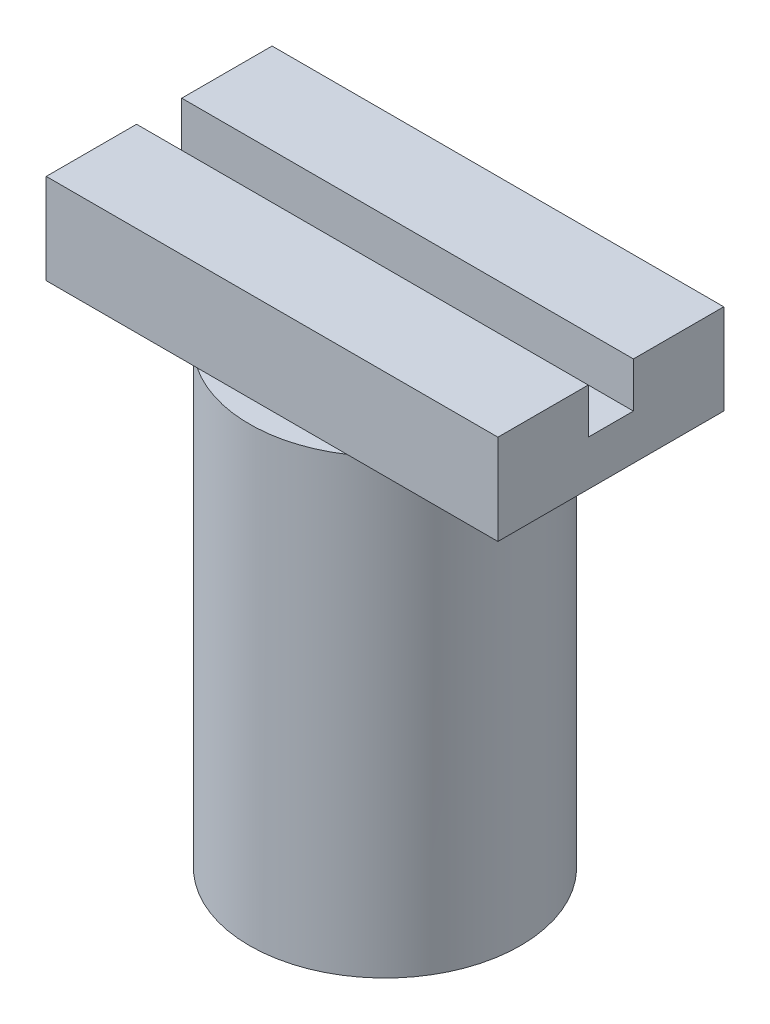
ISO-10303-21;
HEADER;
FILE_DESCRIPTION(('STEP AP214'),'2;1');
FILE_NAME('part.step','',(''),(''),'','','');
FILE_SCHEMA(('AUTOMOTIVE_DESIGN { 1 0 10303 214 1 1 1 1 }'));
ENDSEC;
DATA;
#1=APPLICATION_CONTEXT('core data for automotive mechanical design processes');
#2=APPLICATION_PROTOCOL_DEFINITION('international standard','automotive_design',2000,#1);
#3=PRODUCT_CONTEXT('',#1,'mechanical');
#4=PRODUCT('Part','Part','',(#3));
#5=PRODUCT_RELATED_PRODUCT_CATEGORY('part','',(#4));
#6=PRODUCT_DEFINITION_FORMATION('','',#4);
#7=PRODUCT_DEFINITION_CONTEXT('part definition',#1,'design');
#8=PRODUCT_DEFINITION('design','',#6,#7);
#9=PRODUCT_DEFINITION_SHAPE('','',#8);
#10=(LENGTH_UNIT() NAMED_UNIT(*) SI_UNIT(.MILLI.,.METRE.));
#11=(NAMED_UNIT(*) PLANE_ANGLE_UNIT() SI_UNIT($,.RADIAN.));
#12=(NAMED_UNIT(*) SI_UNIT($,.STERADIAN.) SOLID_ANGLE_UNIT());
#13=UNCERTAINTY_MEASURE_WITH_UNIT(LENGTH_MEASURE(1.E-05),#10,'distance_accuracy_value','');
#14=(GEOMETRIC_REPRESENTATION_CONTEXT(3) GLOBAL_UNCERTAINTY_ASSIGNED_CONTEXT((#13)) GLOBAL_UNIT_ASSIGNED_CONTEXT((#10,
#11,#12)) REPRESENTATION_CONTEXT('',''));
#15=CARTESIAN_POINT('',(0.,0.,0.));
#16=DIRECTION('',(0.,0.,1.));
#17=DIRECTION('',(1.,0.,0.));
#18=AXIS2_PLACEMENT_3D('',#15,#16,#17);
#19=CARTESIAN_POINT('',(0.,12.,0.));
#20=DIRECTION('',(0.,-1.,0.));
#21=DIRECTION('',(0.,0.,-1.));
#22=AXIS2_PLACEMENT_3D('',#19,#20,#21);
#23=PLANE('',#22);
#24=DIRECTION('',(0.,0.,1.));
#25=VECTOR('',#24,1.);
#26=CARTESIAN_POINT('',(-5.,12.,2.5));
#27=LINE('',#26,#25);
#28=CARTESIAN_POINT('',(-5.,12.,-2.5));
#29=VERTEX_POINT('',#28);
#30=CARTESIAN_POINT('',(-5.,12.,-0.5));
#31=VERTEX_POINT('',#30);
#32=EDGE_CURVE('E165',#29,#31,#27,.T.);
#33=ORIENTED_EDGE('',*,*,#32,.T.);
#34=DIRECTION('',(-1.,0.,0.));
#35=VECTOR('',#34,1.);
#36=CARTESIAN_POINT('',(5.,12.,-0.5));
#37=LINE('',#36,#35);
#38=CARTESIAN_POINT('',(5.,12.,-0.5));
#39=VERTEX_POINT('',#38);
#40=EDGE_CURVE('E142',#39,#31,#37,.T.);
#41=ORIENTED_EDGE('',*,*,#40,.F.);
#42=DIRECTION('',(0.,0.,-1.));
#43=VECTOR('',#42,1.);
#44=CARTESIAN_POINT('',(5.,12.,2.5));
#45=LINE('',#44,#43);
#46=CARTESIAN_POINT('',(5.,12.,-2.5));
#47=VERTEX_POINT('',#46);
#48=EDGE_CURVE('E162',#39,#47,#45,.T.);
#49=ORIENTED_EDGE('',*,*,#48,.T.);
#50=DIRECTION('',(-1.,0.,0.));
#51=VECTOR('',#50,1.);
#52=CARTESIAN_POINT('',(-5.,12.,-2.5));
#53=LINE('',#52,#51);
#54=EDGE_CURVE('E161',#47,#29,#53,.T.);
#55=ORIENTED_EDGE('',*,*,#54,.T.);
#56=EDGE_LOOP('',(#33,#41,#49,#55));
#57=FACE_BOUND('',#56,.T.);
#58=ADVANCED_FACE('F45',(#57),#23,.F.);
#59=CARTESIAN_POINT('',(0.,10.,0.));
#60=DIRECTION('',(0.,1.,0.));
#61=DIRECTION('',(0.,0.,1.));
#62=AXIS2_PLACEMENT_3D('',#59,#60,#61);
#63=PLANE('',#62);
#64=DIRECTION('',(1.,0.,0.));
#65=VECTOR('',#64,1.);
#66=CARTESIAN_POINT('',(-5.,10.,2.5));
#67=LINE('',#66,#65);
#68=CARTESIAN_POINT('',(-1.6583123951777,10.,2.5));
#69=VERTEX_POINT('',#68);
#70=CARTESIAN_POINT('',(1.6583123951777,10.,2.5));
#71=VERTEX_POINT('',#70);
#72=EDGE_CURVE('E11',#69,#71,#67,.T.);
#73=ORIENTED_EDGE('',*,*,#72,.F.);
#74=CARTESIAN_POINT('',(0.,10.,0.));
#75=DIRECTION('',(0.,1.,0.));
#76=DIRECTION('',(0.,0.,1.));
#77=AXIS2_PLACEMENT_3D('',#74,#75,#76);
#78=CIRCLE('',#77,3.);
#79=EDGE_CURVE('E206',#69,#71,#78,.T.);
#80=ORIENTED_EDGE('',*,*,#79,.T.);
#81=EDGE_LOOP('',(#73,#80));
#82=FACE_BOUND('',#81,.T.);
#83=ADVANCED_FACE('F235',(#82),#63,.T.);
#84=CARTESIAN_POINT('',(0.,10.,0.));
#85=DIRECTION('',(0.,-1.,0.));
#86=DIRECTION('',(0.,0.,-1.));
#87=AXIS2_PLACEMENT_3D('',#84,#85,#86);
#88=CYLINDRICAL_SURFACE('',#87,3.);
#89=CARTESIAN_POINT('',(1.6583123951777,10.,-2.5));
#90=VERTEX_POINT('',#89);
#91=EDGE_CURVE('E202',#71,#90,#78,.T.);
#92=ORIENTED_EDGE('',*,*,#91,.F.);
#93=ORIENTED_EDGE('',*,*,#79,.F.);
#94=CARTESIAN_POINT('',(-1.6583123951777,10.,-2.5));
#95=VERTEX_POINT('',#94);
#96=EDGE_CURVE('E213',#95,#69,#78,.T.);
#97=ORIENTED_EDGE('',*,*,#96,.F.);
#98=EDGE_CURVE('E205',#90,#95,#78,.T.);
#99=ORIENTED_EDGE('',*,*,#98,.F.);
#100=EDGE_LOOP('',(#92,#93,#97,#99));
#101=FACE_BOUND('',#100,.T.);
#102=CARTESIAN_POINT('',(0.,0.,0.));
#103=DIRECTION('',(0.,1.,0.));
#104=DIRECTION('',(0.,0.,1.));
#105=AXIS2_PLACEMENT_3D('',#102,#103,#104);
#106=CIRCLE('',#105,3.);
#107=CARTESIAN_POINT('',(0.,0.,3.));
#108=VERTEX_POINT('',#107);
#109=EDGE_CURVE('E49',#108,#108,#106,.T.);
#110=ORIENTED_EDGE('',*,*,#109,.T.);
#111=EDGE_LOOP('',(#110));
#112=FACE_BOUND('',#111,.T.);
#113=ADVANCED_FACE('F47',(#101,#112),#88,.T.);
#114=DIRECTION('',(-1.,0.,0.));
#115=VECTOR('',#114,1.);
#116=CARTESIAN_POINT('',(-5.,10.,-2.5));
#117=LINE('',#116,#115);
#118=EDGE_CURVE('E55',#90,#95,#117,.T.);
#119=ORIENTED_EDGE('',*,*,#118,.F.);
#120=ORIENTED_EDGE('',*,*,#98,.T.);
#121=EDGE_LOOP('',(#119,#120));
#122=FACE_BOUND('',#121,.T.);
#123=ADVANCED_FACE('F225',(#122),#63,.T.);
#124=CARTESIAN_POINT('',(0.,0.,0.));
#125=DIRECTION('',(0.,1.,0.));
#126=DIRECTION('',(0.,0.,1.));
#127=AXIS2_PLACEMENT_3D('',#124,#125,#126);
#128=PLANE('',#127);
#129=ORIENTED_EDGE('',*,*,#109,.F.);
#130=EDGE_LOOP('',(#129));
#131=FACE_BOUND('',#130,.T.);
#132=ADVANCED_FACE('F222',(#131),#128,.F.);
#133=CARTESIAN_POINT('',(0.,10.,0.));
#134=DIRECTION('',(0.,-1.,0.));
#135=DIRECTION('',(0.,0.,-1.));
#136=AXIS2_PLACEMENT_3D('',#133,#134,#135);
#137=PLANE('',#136);
#138=CARTESIAN_POINT('',(5.,10.,2.5));
#139=VERTEX_POINT('',#138);
#140=EDGE_CURVE('E58',#71,#139,#67,.T.);
#141=ORIENTED_EDGE('',*,*,#140,.F.);
#142=ORIENTED_EDGE('',*,*,#91,.T.);
#143=CARTESIAN_POINT('',(5.,10.,-2.5));
#144=VERTEX_POINT('',#143);
#145=EDGE_CURVE('E179',#144,#90,#117,.T.);
#146=ORIENTED_EDGE('',*,*,#145,.F.);
#147=DIRECTION('',(0.,0.,-1.));
#148=VECTOR('',#147,1.);
#149=CARTESIAN_POINT('',(5.,10.,2.5));
#150=LINE('',#149,#148);
#151=EDGE_CURVE('E173',#139,#144,#150,.T.);
#152=ORIENTED_EDGE('',*,*,#151,.F.);
#153=EDGE_LOOP('',(#141,#142,#146,#152));
#154=FACE_BOUND('',#153,.T.);
#155=ADVANCED_FACE('F224',(#154),#137,.T.);
#156=CARTESIAN_POINT('',(5.,12.,2.5));
#157=DIRECTION('',(-1.,0.,0.));
#158=DIRECTION('',(0.,0.,1.));
#159=AXIS2_PLACEMENT_3D('',#156,#157,#158);
#160=PLANE('',#159);
#161=ORIENTED_EDGE('',*,*,#48,.F.);
#162=DIRECTION('',(0.,1.,0.));
#163=VECTOR('',#162,1.);
#164=CARTESIAN_POINT('',(5.,11.,-0.5));
#165=LINE('',#164,#163);
#166=CARTESIAN_POINT('',(5.,11.,-0.5));
#167=VERTEX_POINT('',#166);
#168=EDGE_CURVE('E152',#167,#39,#165,.T.);
#169=ORIENTED_EDGE('',*,*,#168,.F.);
#170=DIRECTION('',(0.,0.,-1.));
#171=VECTOR('',#170,1.);
#172=CARTESIAN_POINT('',(5.,11.,-0.5));
#173=LINE('',#172,#171);
#174=CARTESIAN_POINT('',(5.,11.,0.5));
#175=VERTEX_POINT('',#174);
#176=EDGE_CURVE('E131',#175,#167,#173,.T.);
#177=ORIENTED_EDGE('',*,*,#176,.F.);
#178=DIRECTION('',(0.,1.,0.));
#179=VECTOR('',#178,1.);
#180=CARTESIAN_POINT('',(5.,11.,0.5));
#181=LINE('',#180,#179);
#182=CARTESIAN_POINT('',(5.,12.,0.5));
#183=VERTEX_POINT('',#182);
#184=EDGE_CURVE('E127',#175,#183,#181,.T.);
#185=ORIENTED_EDGE('',*,*,#184,.T.);
#186=CARTESIAN_POINT('',(5.,12.,2.5));
#187=VERTEX_POINT('',#186);
#188=EDGE_CURVE('E157',#187,#183,#45,.T.);
#189=ORIENTED_EDGE('',*,*,#188,.F.);
#190=DIRECTION('',(0.,-1.,0.));
#191=VECTOR('',#190,1.);
#192=CARTESIAN_POINT('',(5.,12.,2.5));
#193=LINE('',#192,#191);
#194=EDGE_CURVE('E172',#187,#139,#193,.T.);
#195=ORIENTED_EDGE('',*,*,#194,.T.);
#196=ORIENTED_EDGE('',*,*,#151,.T.);
#197=DIRECTION('',(0.,-1.,0.));
#198=VECTOR('',#197,1.);
#199=CARTESIAN_POINT('',(5.,12.,-2.5));
#200=LINE('',#199,#198);
#201=EDGE_CURVE('E199',#47,#144,#200,.T.);
#202=ORIENTED_EDGE('',*,*,#201,.F.);
#203=EDGE_LOOP('',(#161,#169,#177,#185,#189,#195,#196,#202));
#204=FACE_BOUND('',#203,.T.);
#205=ADVANCED_FACE('F230',(#204),#160,.F.);
#206=CARTESIAN_POINT('',(-5.,12.,-2.5));
#207=DIRECTION('',(0.,0.,1.));
#208=DIRECTION('',(1.,0.,0.));
#209=AXIS2_PLACEMENT_3D('',#206,#207,#208);
#210=PLANE('',#209);
#211=ORIENTED_EDGE('',*,*,#145,.T.);
#212=ORIENTED_EDGE('',*,*,#118,.T.);
#213=CARTESIAN_POINT('',(-5.,10.,-2.5));
#214=VERTEX_POINT('',#213);
#215=EDGE_CURVE('E177',#95,#214,#117,.T.);
#216=ORIENTED_EDGE('',*,*,#215,.T.);
#217=DIRECTION('',(0.,-1.,0.));
#218=VECTOR('',#217,1.);
#219=CARTESIAN_POINT('',(-5.,12.,-2.5));
#220=LINE('',#219,#218);
#221=EDGE_CURVE('E195',#29,#214,#220,.T.);
#222=ORIENTED_EDGE('',*,*,#221,.F.);
#223=ORIENTED_EDGE('',*,*,#54,.F.);
#224=ORIENTED_EDGE('',*,*,#201,.T.);
#225=EDGE_LOOP('',(#211,#212,#216,#222,#223,#224));
#226=FACE_BOUND('',#225,.T.);
#227=ADVANCED_FACE('F283',(#226),#210,.F.);
#228=CARTESIAN_POINT('',(-5.,12.,2.5));
#229=DIRECTION('',(1.,0.,0.));
#230=DIRECTION('',(0.,0.,-1.));
#231=AXIS2_PLACEMENT_3D('',#228,#229,#230);
#232=PLANE('',#231);
#233=DIRECTION('',(0.,0.,1.));
#234=VECTOR('',#233,1.);
#235=CARTESIAN_POINT('',(-5.,11.,-0.5));
#236=LINE('',#235,#234);
#237=CARTESIAN_POINT('',(-5.,11.,-0.5));
#238=VERTEX_POINT('',#237);
#239=CARTESIAN_POINT('',(-5.,11.,0.5));
#240=VERTEX_POINT('',#239);
#241=EDGE_CURVE('E132',#238,#240,#236,.T.);
#242=ORIENTED_EDGE('',*,*,#241,.F.);
#243=DIRECTION('',(0.,1.,0.));
#244=VECTOR('',#243,1.);
#245=CARTESIAN_POINT('',(-5.,11.,-0.5));
#246=LINE('',#245,#244);
#247=EDGE_CURVE('E178',#238,#31,#246,.T.);
#248=ORIENTED_EDGE('',*,*,#247,.T.);
#249=ORIENTED_EDGE('',*,*,#32,.F.);
#250=ORIENTED_EDGE('',*,*,#221,.T.);
#251=DIRECTION('',(0.,0.,1.));
#252=VECTOR('',#251,1.);
#253=CARTESIAN_POINT('',(-5.,10.,2.5));
#254=LINE('',#253,#252);
#255=CARTESIAN_POINT('',(-5.,10.,2.5));
#256=VERTEX_POINT('',#255);
#257=EDGE_CURVE('E183',#214,#256,#254,.T.);
#258=ORIENTED_EDGE('',*,*,#257,.T.);
#259=DIRECTION('',(0.,-1.,0.));
#260=VECTOR('',#259,1.);
#261=CARTESIAN_POINT('',(-5.,12.,2.5));
#262=LINE('',#261,#260);
#263=CARTESIAN_POINT('',(-5.,12.,2.5));
#264=VERTEX_POINT('',#263);
#265=EDGE_CURVE('E191',#264,#256,#262,.T.);
#266=ORIENTED_EDGE('',*,*,#265,.F.);
#267=CARTESIAN_POINT('',(-5.,12.,0.5));
#268=VERTEX_POINT('',#267);
#269=EDGE_CURVE('E147',#268,#264,#27,.T.);
#270=ORIENTED_EDGE('',*,*,#269,.F.);
#271=DIRECTION('',(0.,1.,0.));
#272=VECTOR('',#271,1.);
#273=CARTESIAN_POINT('',(-5.,11.,0.5));
#274=LINE('',#273,#272);
#275=EDGE_CURVE('E65',#240,#268,#274,.T.);
#276=ORIENTED_EDGE('',*,*,#275,.F.);
#277=EDGE_LOOP('',(#242,#248,#249,#250,#258,#266,#270,#276));
#278=FACE_BOUND('',#277,.T.);
#279=ADVANCED_FACE('F145',(#278),#232,.F.);
#280=CARTESIAN_POINT('',(-5.,12.,2.5));
#281=DIRECTION('',(0.,0.,-1.));
#282=DIRECTION('',(-1.,0.,0.));
#283=AXIS2_PLACEMENT_3D('',#280,#281,#282);
#284=PLANE('',#283);
#285=EDGE_CURVE('E57',#256,#69,#67,.T.);
#286=ORIENTED_EDGE('',*,*,#285,.T.);
#287=ORIENTED_EDGE('',*,*,#72,.T.);
#288=ORIENTED_EDGE('',*,*,#140,.T.);
#289=ORIENTED_EDGE('',*,*,#194,.F.);
#290=DIRECTION('',(1.,0.,0.));
#291=VECTOR('',#290,1.);
#292=CARTESIAN_POINT('',(-5.,12.,2.5));
#293=LINE('',#292,#291);
#294=EDGE_CURVE('E169',#264,#187,#293,.T.);
#295=ORIENTED_EDGE('',*,*,#294,.F.);
#296=ORIENTED_EDGE('',*,*,#265,.T.);
#297=EDGE_LOOP('',(#286,#287,#288,#289,#295,#296));
#298=FACE_BOUND('',#297,.T.);
#299=ADVANCED_FACE('F245',(#298),#284,.F.);
#300=ORIENTED_EDGE('',*,*,#188,.T.);
#301=DIRECTION('',(1.,0.,0.));
#302=VECTOR('',#301,1.);
#303=CARTESIAN_POINT('',(5.,12.,0.5));
#304=LINE('',#303,#302);
#305=EDGE_CURVE('E256',#268,#183,#304,.T.);
#306=ORIENTED_EDGE('',*,*,#305,.F.);
#307=ORIENTED_EDGE('',*,*,#269,.T.);
#308=ORIENTED_EDGE('',*,*,#294,.T.);
#309=EDGE_LOOP('',(#300,#306,#307,#308));
#310=FACE_BOUND('',#309,.T.);
#311=ADVANCED_FACE('F239',(#310),#23,.F.);
#312=ORIENTED_EDGE('',*,*,#215,.F.);
#313=ORIENTED_EDGE('',*,*,#96,.T.);
#314=ORIENTED_EDGE('',*,*,#285,.F.);
#315=ORIENTED_EDGE('',*,*,#257,.F.);
#316=EDGE_LOOP('',(#312,#313,#314,#315));
#317=FACE_BOUND('',#316,.T.);
#318=ADVANCED_FACE('F232',(#317),#137,.T.);
#319=CARTESIAN_POINT('',(5.,11.,-0.5));
#320=DIRECTION('',(0.,0.,-1.));
#321=DIRECTION('',(-1.,0.,0.));
#322=AXIS2_PLACEMENT_3D('',#319,#320,#321);
#323=PLANE('',#322);
#324=ORIENTED_EDGE('',*,*,#40,.T.);
#325=ORIENTED_EDGE('',*,*,#247,.F.);
#326=DIRECTION('',(-1.,0.,0.));
#327=VECTOR('',#326,1.);
#328=CARTESIAN_POINT('',(5.,11.,-0.5));
#329=LINE('',#328,#327);
#330=EDGE_CURVE('E138',#167,#238,#329,.T.);
#331=ORIENTED_EDGE('',*,*,#330,.F.);
#332=ORIENTED_EDGE('',*,*,#168,.T.);
#333=EDGE_LOOP('',(#324,#325,#331,#332));
#334=FACE_BOUND('',#333,.T.);
#335=ADVANCED_FACE('F251',(#334),#323,.F.);
#336=CARTESIAN_POINT('',(5.,11.,0.5));
#337=DIRECTION('',(0.,0.,1.));
#338=DIRECTION('',(1.,0.,0.));
#339=AXIS2_PLACEMENT_3D('',#336,#337,#338);
#340=PLANE('',#339);
#341=ORIENTED_EDGE('',*,*,#305,.T.);
#342=ORIENTED_EDGE('',*,*,#184,.F.);
#343=DIRECTION('',(1.,0.,0.));
#344=VECTOR('',#343,1.);
#345=CARTESIAN_POINT('',(5.,11.,0.5));
#346=LINE('',#345,#344);
#347=EDGE_CURVE('E123',#240,#175,#346,.T.);
#348=ORIENTED_EDGE('',*,*,#347,.F.);
#349=ORIENTED_EDGE('',*,*,#275,.T.);
#350=EDGE_LOOP('',(#341,#342,#348,#349));
#351=FACE_BOUND('',#350,.T.);
#352=ADVANCED_FACE('F125',(#351),#340,.F.);
#353=CARTESIAN_POINT('',(0.,11.,0.));
#354=DIRECTION('',(0.,-1.,0.));
#355=DIRECTION('',(0.,0.,-1.));
#356=AXIS2_PLACEMENT_3D('',#353,#354,#355);
#357=PLANE('',#356);
#358=ORIENTED_EDGE('',*,*,#241,.T.);
#359=ORIENTED_EDGE('',*,*,#347,.T.);
#360=ORIENTED_EDGE('',*,*,#176,.T.);
#361=ORIENTED_EDGE('',*,*,#330,.T.);
#362=EDGE_LOOP('',(#358,#359,#360,#361));
#363=FACE_BOUND('',#362,.T.);
#364=ADVANCED_FACE('F136',(#363),#357,.F.);
#365=CLOSED_SHELL('',(#58,#83,#113,#123,#132,#155,#205,#227,#279,#299,#311,#318,#335,#352,#364));
#366=MANIFOLD_SOLID_BREP('B2',#365);
#367=ADVANCED_BREP_SHAPE_REPRESENTATION('',(#18,#366),#14);
#368=SHAPE_DEFINITION_REPRESENTATION(#9,#367);
ENDSEC;
END-ISO-10303-21;
